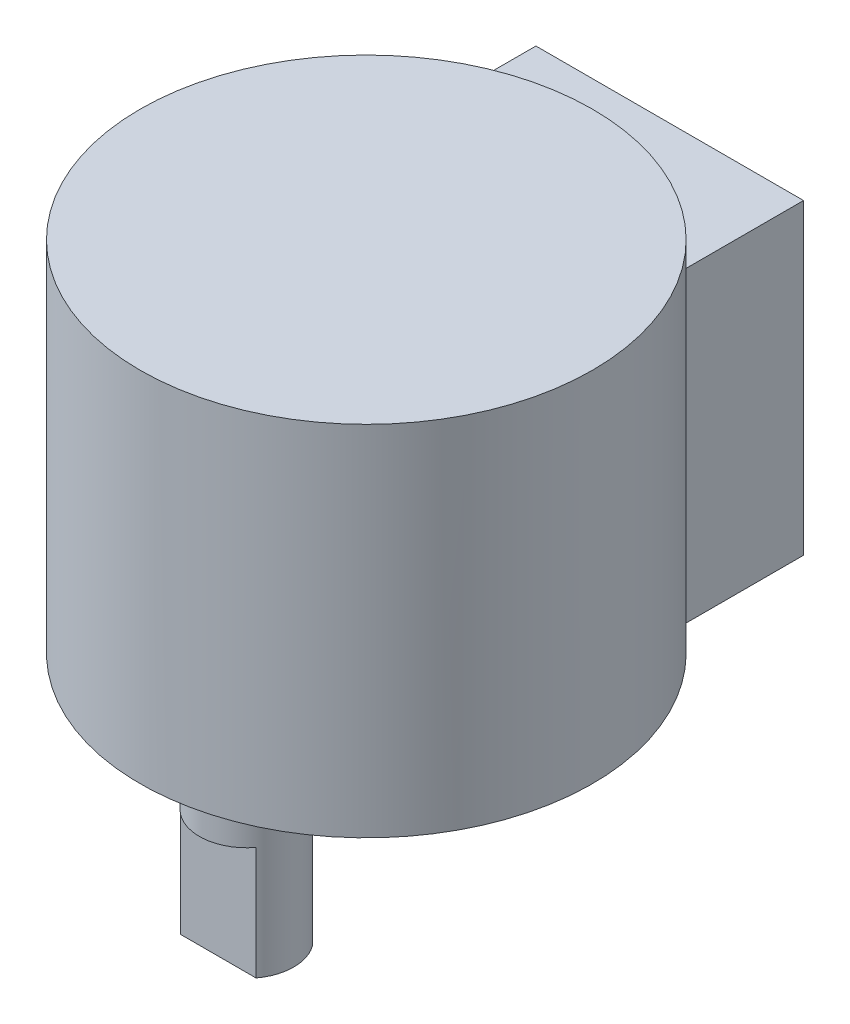
ISO-10303-21;
HEADER;
FILE_DESCRIPTION(('STEP AP214'),'2;1');
FILE_NAME('part.step','',(''),(''),'','','');
FILE_SCHEMA(('AUTOMOTIVE_DESIGN { 1 0 10303 214 1 1 1 1 }'));
ENDSEC;
DATA;
#1=APPLICATION_CONTEXT('core data for automotive mechanical design processes');
#2=APPLICATION_PROTOCOL_DEFINITION('international standard','automotive_design',2000,#1);
#3=PRODUCT_CONTEXT('',#1,'mechanical');
#4=PRODUCT('Part','Part','',(#3));
#5=PRODUCT_RELATED_PRODUCT_CATEGORY('part','',(#4));
#6=PRODUCT_DEFINITION_FORMATION('','',#4);
#7=PRODUCT_DEFINITION_CONTEXT('part definition',#1,'design');
#8=PRODUCT_DEFINITION('design','',#6,#7);
#9=PRODUCT_DEFINITION_SHAPE('','',#8);
#10=(LENGTH_UNIT() NAMED_UNIT(*) SI_UNIT(.MILLI.,.METRE.));
#11=(NAMED_UNIT(*) PLANE_ANGLE_UNIT() SI_UNIT($,.RADIAN.));
#12=(NAMED_UNIT(*) SI_UNIT($,.STERADIAN.) SOLID_ANGLE_UNIT());
#13=UNCERTAINTY_MEASURE_WITH_UNIT(LENGTH_MEASURE(1.E-05),#10,'distance_accuracy_value','');
#14=(GEOMETRIC_REPRESENTATION_CONTEXT(3) GLOBAL_UNCERTAINTY_ASSIGNED_CONTEXT((#13)) GLOBAL_UNIT_ASSIGNED_CONTEXT((#10,
#11,#12)) REPRESENTATION_CONTEXT('',''));
#15=CARTESIAN_POINT('',(0.,0.,0.));
#16=DIRECTION('',(0.,0.,1.));
#17=DIRECTION('',(1.,0.,0.));
#18=AXIS2_PLACEMENT_3D('',#15,#16,#17);
#19=CARTESIAN_POINT('',(0.,-4.,6.35));
#20=DIRECTION('',(0.,-1.,0.));
#21=DIRECTION('',(0.,0.,-1.));
#22=AXIS2_PLACEMENT_3D('',#19,#20,#21);
#23=PLANE('',#22);
#24=DIRECTION('',(-1.,0.,0.));
#25=VECTOR('',#24,1.);
#26=CARTESIAN_POINT('',(-2.,-4.,7.85));
#27=LINE('',#26,#25);
#28=CARTESIAN_POINT('',(2.,-4.,7.85));
#29=VERTEX_POINT('',#28);
#30=CARTESIAN_POINT('',(-2.,-4.,7.85));
#31=VERTEX_POINT('',#30);
#32=EDGE_CURVE('E129',#29,#31,#27,.T.);
#33=ORIENTED_EDGE('',*,*,#32,.F.);
#34=CARTESIAN_POINT('',(0.,-4.,6.35));
#35=DIRECTION('',(0.,-1.,0.));
#36=DIRECTION('',(0.,0.,-1.));
#37=AXIS2_PLACEMENT_3D('',#34,#35,#36);
#38=CIRCLE('',#37,2.5);
#39=EDGE_CURVE('E64',#29,#31,#38,.T.);
#40=ORIENTED_EDGE('',*,*,#39,.T.);
#41=EDGE_LOOP('',(#33,#40));
#42=FACE_BOUND('',#41,.T.);
#43=ADVANCED_FACE('F41',(#42),#23,.T.);
#44=CARTESIAN_POINT('',(0.,19.,0.));
#45=DIRECTION('',(0.,-1.,0.));
#46=DIRECTION('',(0.,0.,-1.));
#47=AXIS2_PLACEMENT_3D('',#44,#45,#46);
#48=CYLINDRICAL_SURFACE('',#47,12.);
#49=CARTESIAN_POINT('',(0.,19.,0.));
#50=DIRECTION('',(0.,1.,0.));
#51=DIRECTION('',(0.,0.,1.));
#52=AXIS2_PLACEMENT_3D('',#49,#50,#51);
#53=CIRCLE('',#52,12.);
#54=CARTESIAN_POINT('',(0.,19.,12.));
#55=VERTEX_POINT('',#54);
#56=EDGE_CURVE('E186',#55,#55,#53,.T.);
#57=ORIENTED_EDGE('',*,*,#56,.F.);
#58=EDGE_LOOP('',(#57));
#59=FACE_BOUND('',#58,.T.);
#60=CARTESIAN_POINT('',(0.,16.3,0.));
#61=DIRECTION('',(0.,1.,0.));
#62=DIRECTION('',(0.,0.,1.));
#63=AXIS2_PLACEMENT_3D('',#60,#61,#62);
#64=CIRCLE('',#63,12.);
#65=CARTESIAN_POINT('',(7.1,16.3,-9.67419247275968));
#66=VERTEX_POINT('',#65);
#67=CARTESIAN_POINT('',(-7.1,16.3,-9.67419247275968));
#68=VERTEX_POINT('',#67);
#69=EDGE_CURVE('E190',#66,#68,#64,.T.);
#70=ORIENTED_EDGE('',*,*,#69,.T.);
#71=DIRECTION('',(0.,-1.,0.));
#72=VECTOR('',#71,1.);
#73=CARTESIAN_POINT('',(-7.1,16.3,-9.67419247275968));
#74=LINE('',#73,#72);
#75=CARTESIAN_POINT('',(-7.1,0.,-9.67419247275968));
#76=VERTEX_POINT('',#75);
#77=EDGE_CURVE('E179',#68,#76,#74,.T.);
#78=ORIENTED_EDGE('',*,*,#77,.T.);
#79=CARTESIAN_POINT('',(0.,0.,0.));
#80=DIRECTION('',(0.,1.,0.));
#81=DIRECTION('',(0.,0.,1.));
#82=AXIS2_PLACEMENT_3D('',#79,#80,#81);
#83=CIRCLE('',#82,12.);
#84=CARTESIAN_POINT('',(7.1,0.,-9.67419247275968));
#85=VERTEX_POINT('',#84);
#86=EDGE_CURVE('E175',#76,#85,#83,.T.);
#87=ORIENTED_EDGE('',*,*,#86,.T.);
#88=DIRECTION('',(0.,-1.,0.));
#89=VECTOR('',#88,1.);
#90=CARTESIAN_POINT('',(7.1,16.3,-9.67419247275968));
#91=LINE('',#90,#89);
#92=EDGE_CURVE('E161',#66,#85,#91,.T.);
#93=ORIENTED_EDGE('',*,*,#92,.F.);
#94=EDGE_LOOP('',(#70,#78,#87,#93));
#95=FACE_BOUND('',#94,.T.);
#96=ADVANCED_FACE('F43',(#59,#95),#48,.T.);
#97=CARTESIAN_POINT('',(0.,19.,0.));
#98=DIRECTION('',(0.,1.,0.));
#99=DIRECTION('',(0.,0.,1.));
#100=AXIS2_PLACEMENT_3D('',#97,#98,#99);
#101=PLANE('',#100);
#102=ORIENTED_EDGE('',*,*,#56,.T.);
#103=EDGE_LOOP('',(#102));
#104=FACE_BOUND('',#103,.T.);
#105=ADVANCED_FACE('F206',(#104),#101,.T.);
#106=CARTESIAN_POINT('',(0.,0.,0.));
#107=DIRECTION('',(0.,1.,0.));
#108=DIRECTION('',(0.,0.,1.));
#109=AXIS2_PLACEMENT_3D('',#106,#107,#108);
#110=PLANE('',#109);
#111=CARTESIAN_POINT('',(0.,0.,6.35));
#112=DIRECTION('',(0.,1.,0.));
#113=DIRECTION('',(0.,0.,1.));
#114=AXIS2_PLACEMENT_3D('',#111,#112,#113);
#115=CIRCLE('',#114,3.5);
#116=CARTESIAN_POINT('',(0.,0.,9.85));
#117=VERTEX_POINT('',#116);
#118=EDGE_CURVE('E45',#117,#117,#115,.F.);
#119=ORIENTED_EDGE('',*,*,#118,.F.);
#120=EDGE_LOOP('',(#119));
#121=FACE_BOUND('',#120,.T.);
#122=ORIENTED_EDGE('',*,*,#86,.F.);
#123=DIRECTION('',(0.,0.,-1.));
#124=VECTOR('',#123,1.);
#125=CARTESIAN_POINT('',(-7.1,0.,-16.1));
#126=LINE('',#125,#124);
#127=CARTESIAN_POINT('',(-7.1,0.,-16.1));
#128=VERTEX_POINT('',#127);
#129=EDGE_CURVE('E165',#76,#128,#126,.T.);
#130=ORIENTED_EDGE('',*,*,#129,.T.);
#131=DIRECTION('',(1.,0.,0.));
#132=VECTOR('',#131,1.);
#133=CARTESIAN_POINT('',(-7.1,0.,-16.1));
#134=LINE('',#133,#132);
#135=CARTESIAN_POINT('',(7.1,0.,-16.1));
#136=VERTEX_POINT('',#135);
#137=EDGE_CURVE('E153',#128,#136,#134,.T.);
#138=ORIENTED_EDGE('',*,*,#137,.T.);
#139=DIRECTION('',(0.,0.,1.));
#140=VECTOR('',#139,1.);
#141=CARTESIAN_POINT('',(7.1,0.,-16.1));
#142=LINE('',#141,#140);
#143=EDGE_CURVE('E147',#136,#85,#142,.T.);
#144=ORIENTED_EDGE('',*,*,#143,.T.);
#145=EDGE_LOOP('',(#122,#130,#138,#144));
#146=FACE_BOUND('',#145,.T.);
#147=ADVANCED_FACE('F202',(#121,#146),#110,.F.);
#148=CARTESIAN_POINT('',(7.1,16.3,-16.1));
#149=DIRECTION('',(1.,0.,0.));
#150=DIRECTION('',(0.,0.,-1.));
#151=AXIS2_PLACEMENT_3D('',#148,#149,#150);
#152=PLANE('',#151);
#153=ORIENTED_EDGE('',*,*,#143,.F.);
#154=DIRECTION('',(0.,-1.,0.));
#155=VECTOR('',#154,1.);
#156=CARTESIAN_POINT('',(7.1,16.3,-16.1));
#157=LINE('',#156,#155);
#158=CARTESIAN_POINT('',(7.1,16.3,-16.1));
#159=VERTEX_POINT('',#158);
#160=EDGE_CURVE('E172',#159,#136,#157,.T.);
#161=ORIENTED_EDGE('',*,*,#160,.F.);
#162=DIRECTION('',(0.,0.,1.));
#163=VECTOR('',#162,1.);
#164=CARTESIAN_POINT('',(7.1,16.3,-16.1));
#165=LINE('',#164,#163);
#166=EDGE_CURVE('E148',#159,#66,#165,.T.);
#167=ORIENTED_EDGE('',*,*,#166,.T.);
#168=ORIENTED_EDGE('',*,*,#92,.T.);
#169=EDGE_LOOP('',(#153,#161,#167,#168));
#170=FACE_BOUND('',#169,.T.);
#171=ADVANCED_FACE('F205',(#170),#152,.T.);
#172=CARTESIAN_POINT('',(-7.1,16.3,-16.1));
#173=DIRECTION('',(0.,0.,-1.));
#174=DIRECTION('',(-1.,0.,0.));
#175=AXIS2_PLACEMENT_3D('',#172,#173,#174);
#176=PLANE('',#175);
#177=CARTESIAN_POINT('',(-3.9,2.5,-16.1));
#178=DIRECTION('',(0.,0.,-1.));
#179=DIRECTION('',(-1.,0.,0.));
#180=AXIS2_PLACEMENT_3D('',#177,#178,#179);
#181=CIRCLE('',#180,0.7);
#182=CARTESIAN_POINT('',(-4.6,2.5,-16.1));
#183=VERTEX_POINT('',#182);
#184=EDGE_CURVE('E314',#183,#183,#181,.T.);
#185=ORIENTED_EDGE('',*,*,#184,.F.);
#186=EDGE_LOOP('',(#185));
#187=FACE_BOUND('',#186,.T.);
#188=CARTESIAN_POINT('',(-2.4,2.5,-16.1));
#189=DIRECTION('',(0.,0.,-1.));
#190=DIRECTION('',(-1.,0.,0.));
#191=AXIS2_PLACEMENT_3D('',#188,#189,#190);
#192=CIRCLE('',#191,0.7);
#193=CARTESIAN_POINT('',(-3.1,2.5,-16.1));
#194=VERTEX_POINT('',#193);
#195=EDGE_CURVE('E318',#194,#194,#192,.T.);
#196=ORIENTED_EDGE('',*,*,#195,.F.);
#197=EDGE_LOOP('',(#196));
#198=FACE_BOUND('',#197,.T.);
#199=CARTESIAN_POINT('',(-0.900000000000001,2.5,-16.1));
#200=DIRECTION('',(0.,0.,-1.));
#201=DIRECTION('',(-1.,0.,0.));
#202=AXIS2_PLACEMENT_3D('',#199,#200,#201);
#203=CIRCLE('',#202,0.7);
#204=CARTESIAN_POINT('',(-1.6,2.5,-16.1));
#205=VERTEX_POINT('',#204);
#206=EDGE_CURVE('E322',#205,#205,#203,.T.);
#207=ORIENTED_EDGE('',*,*,#206,.F.);
#208=EDGE_LOOP('',(#207));
#209=FACE_BOUND('',#208,.T.);
#210=CARTESIAN_POINT('',(0.599999999999999,2.5,-16.1));
#211=DIRECTION('',(0.,0.,-1.));
#212=DIRECTION('',(-1.,0.,0.));
#213=AXIS2_PLACEMENT_3D('',#210,#211,#212);
#214=CIRCLE('',#213,0.7);
#215=CARTESIAN_POINT('',(-0.100000000000001,2.5,-16.1));
#216=VERTEX_POINT('',#215);
#217=EDGE_CURVE('E326',#216,#216,#214,.T.);
#218=ORIENTED_EDGE('',*,*,#217,.F.);
#219=EDGE_LOOP('',(#218));
#220=FACE_BOUND('',#219,.T.);
#221=CARTESIAN_POINT('',(2.1,2.5,-16.1));
#222=DIRECTION('',(0.,0.,-1.));
#223=DIRECTION('',(-1.,0.,0.));
#224=AXIS2_PLACEMENT_3D('',#221,#222,#223);
#225=CIRCLE('',#224,0.7);
#226=CARTESIAN_POINT('',(1.4,2.5,-16.1));
#227=VERTEX_POINT('',#226);
#228=EDGE_CURVE('E330',#227,#227,#225,.T.);
#229=ORIENTED_EDGE('',*,*,#228,.F.);
#230=EDGE_LOOP('',(#229));
#231=FACE_BOUND('',#230,.T.);
#232=CARTESIAN_POINT('',(3.6,2.5,-16.1));
#233=DIRECTION('',(0.,0.,-1.));
#234=DIRECTION('',(-1.,0.,0.));
#235=AXIS2_PLACEMENT_3D('',#232,#233,#234);
#236=CIRCLE('',#235,0.7);
#237=CARTESIAN_POINT('',(2.9,2.5,-16.1));
#238=VERTEX_POINT('',#237);
#239=EDGE_CURVE('E333',#238,#238,#236,.T.);
#240=ORIENTED_EDGE('',*,*,#239,.F.);
#241=EDGE_LOOP('',(#240));
#242=FACE_BOUND('',#241,.T.);
#243=ORIENTED_EDGE('',*,*,#137,.F.);
#244=DIRECTION('',(0.,-1.,0.));
#245=VECTOR('',#244,1.);
#246=CARTESIAN_POINT('',(-7.1,16.3,-16.1));
#247=LINE('',#246,#245);
#248=CARTESIAN_POINT('',(-7.1,16.3,-16.1));
#249=VERTEX_POINT('',#248);
#250=EDGE_CURVE('E176',#249,#128,#247,.T.);
#251=ORIENTED_EDGE('',*,*,#250,.F.);
#252=DIRECTION('',(1.,0.,0.));
#253=VECTOR('',#252,1.);
#254=CARTESIAN_POINT('',(-7.1,16.3,-16.1));
#255=LINE('',#254,#253);
#256=EDGE_CURVE('E157',#249,#159,#255,.T.);
#257=ORIENTED_EDGE('',*,*,#256,.T.);
#258=ORIENTED_EDGE('',*,*,#160,.T.);
#259=EDGE_LOOP('',(#243,#251,#257,#258));
#260=FACE_BOUND('',#259,.T.);
#261=ADVANCED_FACE('F215',(#187,#198,#209,#220,#231,#242,#260),#176,.T.);
#262=CARTESIAN_POINT('',(-7.1,16.3,-16.1));
#263=DIRECTION('',(-1.,0.,0.));
#264=DIRECTION('',(0.,0.,1.));
#265=AXIS2_PLACEMENT_3D('',#262,#263,#264);
#266=PLANE('',#265);
#267=ORIENTED_EDGE('',*,*,#129,.F.);
#268=ORIENTED_EDGE('',*,*,#77,.F.);
#269=DIRECTION('',(0.,0.,-1.));
#270=VECTOR('',#269,1.);
#271=CARTESIAN_POINT('',(-7.1,16.3,-16.1));
#272=LINE('',#271,#270);
#273=EDGE_CURVE('E152',#68,#249,#272,.T.);
#274=ORIENTED_EDGE('',*,*,#273,.T.);
#275=ORIENTED_EDGE('',*,*,#250,.T.);
#276=EDGE_LOOP('',(#267,#268,#274,#275));
#277=FACE_BOUND('',#276,.T.);
#278=ADVANCED_FACE('F212',(#277),#266,.T.);
#279=CARTESIAN_POINT('',(0.,16.3,0.));
#280=DIRECTION('',(0.,1.,0.));
#281=DIRECTION('',(0.,0.,1.));
#282=AXIS2_PLACEMENT_3D('',#279,#280,#281);
#283=PLANE('',#282);
#284=ORIENTED_EDGE('',*,*,#69,.F.);
#285=ORIENTED_EDGE('',*,*,#166,.F.);
#286=ORIENTED_EDGE('',*,*,#256,.F.);
#287=ORIENTED_EDGE('',*,*,#273,.F.);
#288=EDGE_LOOP('',(#284,#285,#286,#287));
#289=FACE_BOUND('',#288,.T.);
#290=ADVANCED_FACE('F219',(#289),#283,.T.);
#291=CARTESIAN_POINT('',(0.,-1.,6.35));
#292=DIRECTION('',(0.,1.,0.));
#293=DIRECTION('',(0.,0.,1.));
#294=AXIS2_PLACEMENT_3D('',#291,#292,#293);
#295=CYLINDRICAL_SURFACE('',#294,3.5);
#296=CARTESIAN_POINT('',(0.,-1.,6.35));
#297=DIRECTION('',(0.,-1.,0.));
#298=DIRECTION('',(0.,0.,-1.));
#299=AXIS2_PLACEMENT_3D('',#296,#297,#298);
#300=CIRCLE('',#299,3.5);
#301=CARTESIAN_POINT('',(0.,-1.,2.85));
#302=VERTEX_POINT('',#301);
#303=EDGE_CURVE('E143',#302,#302,#300,.T.);
#304=ORIENTED_EDGE('',*,*,#303,.F.);
#305=EDGE_LOOP('',(#304));
#306=FACE_BOUND('',#305,.T.);
#307=ORIENTED_EDGE('',*,*,#118,.T.);
#308=EDGE_LOOP('',(#307));
#309=FACE_BOUND('',#308,.T.);
#310=ADVANCED_FACE('F200',(#306,#309),#295,.T.);
#311=CARTESIAN_POINT('',(0.,-1.,6.35));
#312=DIRECTION('',(0.,-1.,0.));
#313=DIRECTION('',(0.,0.,-1.));
#314=AXIS2_PLACEMENT_3D('',#311,#312,#313);
#315=PLANE('',#314);
#316=CARTESIAN_POINT('',(0.,-1.,6.35));
#317=DIRECTION('',(0.,-1.,0.));
#318=DIRECTION('',(0.,0.,-1.));
#319=AXIS2_PLACEMENT_3D('',#316,#317,#318);
#320=CIRCLE('',#319,2.5);
#321=CARTESIAN_POINT('',(0.,-1.,3.85));
#322=VERTEX_POINT('',#321);
#323=EDGE_CURVE('E11',#322,#322,#320,.T.);
#324=ORIENTED_EDGE('',*,*,#323,.F.);
#325=EDGE_LOOP('',(#324));
#326=FACE_BOUND('',#325,.T.);
#327=ORIENTED_EDGE('',*,*,#303,.T.);
#328=EDGE_LOOP('',(#327));
#329=FACE_BOUND('',#328,.T.);
#330=ADVANCED_FACE('F226',(#326,#329),#315,.T.);
#331=CARTESIAN_POINT('',(0.,-4.,6.35));
#332=DIRECTION('',(0.,1.,0.));
#333=DIRECTION('',(0.,0.,1.));
#334=AXIS2_PLACEMENT_3D('',#331,#332,#333);
#335=CYLINDRICAL_SURFACE('',#334,2.5);
#336=ORIENTED_EDGE('',*,*,#39,.F.);
#337=DIRECTION('',(0.,1.,0.));
#338=VECTOR('',#337,1.);
#339=CARTESIAN_POINT('',(2.,-10.,7.85));
#340=LINE('',#339,#338);
#341=CARTESIAN_POINT('',(2.,-10.,7.85));
#342=VERTEX_POINT('',#341);
#343=EDGE_CURVE('E139',#342,#29,#340,.T.);
#344=ORIENTED_EDGE('',*,*,#343,.F.);
#345=CARTESIAN_POINT('',(0.,-10.,6.35));
#346=DIRECTION('',(0.,-1.,0.));
#347=DIRECTION('',(0.,0.,-1.));
#348=AXIS2_PLACEMENT_3D('',#345,#346,#347);
#349=CIRCLE('',#348,2.5);
#350=CARTESIAN_POINT('',(2.,-10.,4.85));
#351=VERTEX_POINT('',#350);
#352=EDGE_CURVE('E118',#351,#342,#349,.T.);
#353=ORIENTED_EDGE('',*,*,#352,.F.);
#354=DIRECTION('',(0.,1.,0.));
#355=VECTOR('',#354,1.);
#356=CARTESIAN_POINT('',(2.,-10.,4.85));
#357=LINE('',#356,#355);
#358=CARTESIAN_POINT('',(2.,-4.,4.85));
#359=VERTEX_POINT('',#358);
#360=EDGE_CURVE('E114',#351,#359,#357,.T.);
#361=ORIENTED_EDGE('',*,*,#360,.T.);
#362=CARTESIAN_POINT('',(-2.,-4.,4.85));
#363=VERTEX_POINT('',#362);
#364=EDGE_CURVE('E133',#363,#359,#38,.T.);
#365=ORIENTED_EDGE('',*,*,#364,.F.);
#366=DIRECTION('',(0.,1.,0.));
#367=VECTOR('',#366,1.);
#368=CARTESIAN_POINT('',(-2.,-10.,4.85));
#369=LINE('',#368,#367);
#370=CARTESIAN_POINT('',(-2.,-10.,4.85));
#371=VERTEX_POINT('',#370);
#372=EDGE_CURVE('E112',#371,#363,#369,.T.);
#373=ORIENTED_EDGE('',*,*,#372,.F.);
#374=CARTESIAN_POINT('',(0.,-10.,6.35));
#375=DIRECTION('',(0.,-1.,0.));
#376=DIRECTION('',(0.,0.,-1.));
#377=AXIS2_PLACEMENT_3D('',#374,#375,#376);
#378=CIRCLE('',#377,2.5);
#379=CARTESIAN_POINT('',(-2.,-10.,7.85));
#380=VERTEX_POINT('',#379);
#381=EDGE_CURVE('E119',#380,#371,#378,.T.);
#382=ORIENTED_EDGE('',*,*,#381,.F.);
#383=DIRECTION('',(0.,1.,0.));
#384=VECTOR('',#383,1.);
#385=CARTESIAN_POINT('',(-2.,-10.,7.85));
#386=LINE('',#385,#384);
#387=EDGE_CURVE('E351',#380,#31,#386,.T.);
#388=ORIENTED_EDGE('',*,*,#387,.T.);
#389=EDGE_LOOP('',(#336,#344,#353,#361,#365,#373,#382,#388));
#390=FACE_BOUND('',#389,.T.);
#391=ORIENTED_EDGE('',*,*,#323,.T.);
#392=EDGE_LOOP('',(#391));
#393=FACE_BOUND('',#392,.T.);
#394=ADVANCED_FACE('F131',(#390,#393),#335,.T.);
#395=DIRECTION('',(1.,0.,0.));
#396=VECTOR('',#395,1.);
#397=CARTESIAN_POINT('',(-2.,-4.,4.85));
#398=LINE('',#397,#396);
#399=EDGE_CURVE('E57',#363,#359,#398,.T.);
#400=ORIENTED_EDGE('',*,*,#399,.F.);
#401=ORIENTED_EDGE('',*,*,#364,.T.);
#402=EDGE_LOOP('',(#400,#401));
#403=FACE_BOUND('',#402,.T.);
#404=ADVANCED_FACE('F233',(#403),#23,.T.);
#405=CARTESIAN_POINT('',(-2.,-10.,4.85));
#406=DIRECTION('',(0.,0.,1.));
#407=DIRECTION('',(1.,0.,0.));
#408=AXIS2_PLACEMENT_3D('',#405,#406,#407);
#409=PLANE('',#408);
#410=ORIENTED_EDGE('',*,*,#399,.T.);
#411=ORIENTED_EDGE('',*,*,#360,.F.);
#412=DIRECTION('',(1.,0.,0.));
#413=VECTOR('',#412,1.);
#414=CARTESIAN_POINT('',(-2.,-10.,4.85));
#415=LINE('',#414,#413);
#416=EDGE_CURVE('E108',#371,#351,#415,.T.);
#417=ORIENTED_EDGE('',*,*,#416,.F.);
#418=ORIENTED_EDGE('',*,*,#372,.T.);
#419=EDGE_LOOP('',(#410,#411,#417,#418));
#420=FACE_BOUND('',#419,.T.);
#421=ADVANCED_FACE('F110',(#420),#409,.F.);
#422=CARTESIAN_POINT('',(-2.,-10.,7.85));
#423=DIRECTION('',(0.,0.,-1.));
#424=DIRECTION('',(-1.,0.,0.));
#425=AXIS2_PLACEMENT_3D('',#422,#423,#424);
#426=PLANE('',#425);
#427=ORIENTED_EDGE('',*,*,#32,.T.);
#428=ORIENTED_EDGE('',*,*,#387,.F.);
#429=DIRECTION('',(-1.,0.,0.));
#430=VECTOR('',#429,1.);
#431=CARTESIAN_POINT('',(-2.,-10.,7.85));
#432=LINE('',#431,#430);
#433=EDGE_CURVE('E124',#342,#380,#432,.T.);
#434=ORIENTED_EDGE('',*,*,#433,.F.);
#435=ORIENTED_EDGE('',*,*,#343,.T.);
#436=EDGE_LOOP('',(#427,#428,#434,#435));
#437=FACE_BOUND('',#436,.T.);
#438=ADVANCED_FACE('F245',(#437),#426,.F.);
#439=CARTESIAN_POINT('',(0.,-10.,6.35));
#440=DIRECTION('',(0.,-1.,0.));
#441=DIRECTION('',(0.,0.,-1.));
#442=AXIS2_PLACEMENT_3D('',#439,#440,#441);
#443=PLANE('',#442);
#444=ORIENTED_EDGE('',*,*,#381,.T.);
#445=ORIENTED_EDGE('',*,*,#416,.T.);
#446=ORIENTED_EDGE('',*,*,#352,.T.);
#447=ORIENTED_EDGE('',*,*,#433,.T.);
#448=EDGE_LOOP('',(#444,#445,#446,#447));
#449=FACE_BOUND('',#448,.T.);
#450=ADVANCED_FACE('F122',(#449),#443,.T.);
#451=CARTESIAN_POINT('',(3.6,2.5,-18.1));
#452=DIRECTION('',(0.,0.,1.));
#453=DIRECTION('',(1.,0.,0.));
#454=AXIS2_PLACEMENT_3D('',#451,#452,#453);
#455=CYLINDRICAL_SURFACE('',#454,0.7);
#456=CARTESIAN_POINT('',(3.6,2.5,-18.1));
#457=DIRECTION('',(0.,0.,-1.));
#458=DIRECTION('',(-1.,0.,0.));
#459=AXIS2_PLACEMENT_3D('',#456,#457,#458);
#460=CIRCLE('',#459,0.7);
#461=CARTESIAN_POINT('',(2.9,2.5,-18.1));
#462=VERTEX_POINT('',#461);
#463=EDGE_CURVE('E336',#462,#462,#460,.T.);
#464=ORIENTED_EDGE('',*,*,#463,.F.);
#465=EDGE_LOOP('',(#464));
#466=FACE_BOUND('',#465,.T.);
#467=ORIENTED_EDGE('',*,*,#239,.T.);
#468=EDGE_LOOP('',(#467));
#469=FACE_BOUND('',#468,.T.);
#470=ADVANCED_FACE('F367',(#466,#469),#455,.T.);
#471=CARTESIAN_POINT('',(3.6,2.5,-18.1));
#472=DIRECTION('',(0.,0.,-1.));
#473=DIRECTION('',(-1.,0.,0.));
#474=AXIS2_PLACEMENT_3D('',#471,#472,#473);
#475=PLANE('',#474);
#476=ORIENTED_EDGE('',*,*,#463,.T.);
#477=EDGE_LOOP('',(#476));
#478=FACE_BOUND('',#477,.T.);
#479=ADVANCED_FACE('F372',(#478),#475,.T.);
#480=CARTESIAN_POINT('',(2.1,2.5,-18.1));
#481=DIRECTION('',(0.,0.,1.));
#482=DIRECTION('',(1.,0.,0.));
#483=AXIS2_PLACEMENT_3D('',#480,#481,#482);
#484=CYLINDRICAL_SURFACE('',#483,0.7);
#485=CARTESIAN_POINT('',(2.1,2.5,-18.1));
#486=DIRECTION('',(0.,0.,-1.));
#487=DIRECTION('',(-1.,0.,0.));
#488=AXIS2_PLACEMENT_3D('',#485,#486,#487);
#489=CIRCLE('',#488,0.7);
#490=CARTESIAN_POINT('',(1.4,2.5,-18.1));
#491=VERTEX_POINT('',#490);
#492=EDGE_CURVE('E337',#491,#491,#489,.T.);
#493=ORIENTED_EDGE('',*,*,#492,.F.);
#494=EDGE_LOOP('',(#493));
#495=FACE_BOUND('',#494,.T.);
#496=ORIENTED_EDGE('',*,*,#228,.T.);
#497=EDGE_LOOP('',(#496));
#498=FACE_BOUND('',#497,.T.);
#499=ADVANCED_FACE('F376',(#495,#498),#484,.T.);
#500=CARTESIAN_POINT('',(2.1,2.5,-18.1));
#501=DIRECTION('',(0.,0.,-1.));
#502=DIRECTION('',(-1.,0.,0.));
#503=AXIS2_PLACEMENT_3D('',#500,#501,#502);
#504=PLANE('',#503);
#505=ORIENTED_EDGE('',*,*,#492,.T.);
#506=EDGE_LOOP('',(#505));
#507=FACE_BOUND('',#506,.T.);
#508=ADVANCED_FACE('F380',(#507),#504,.T.);
#509=CARTESIAN_POINT('',(0.6,2.5,-18.1));
#510=DIRECTION('',(0.,0.,1.));
#511=DIRECTION('',(1.,0.,0.));
#512=AXIS2_PLACEMENT_3D('',#509,#510,#511);
#513=CYLINDRICAL_SURFACE('',#512,0.7);
#514=CARTESIAN_POINT('',(0.6,2.5,-18.1));
#515=DIRECTION('',(0.,0.,-1.));
#516=DIRECTION('',(-1.,0.,0.));
#517=AXIS2_PLACEMENT_3D('',#514,#515,#516);
#518=CIRCLE('',#517,0.7);
#519=CARTESIAN_POINT('',(-0.100000000000001,2.5,-18.1));
#520=VERTEX_POINT('',#519);
#521=EDGE_CURVE('E438',#520,#520,#518,.T.);
#522=ORIENTED_EDGE('',*,*,#521,.F.);
#523=EDGE_LOOP('',(#522));
#524=FACE_BOUND('',#523,.T.);
#525=ORIENTED_EDGE('',*,*,#217,.T.);
#526=EDGE_LOOP('',(#525));
#527=FACE_BOUND('',#526,.T.);
#528=ADVANCED_FACE('F384',(#524,#527),#513,.T.);
#529=CARTESIAN_POINT('',(0.6,2.5,-18.1));
#530=DIRECTION('',(0.,0.,-1.));
#531=DIRECTION('',(-1.,0.,0.));
#532=AXIS2_PLACEMENT_3D('',#529,#530,#531);
#533=PLANE('',#532);
#534=ORIENTED_EDGE('',*,*,#521,.T.);
#535=EDGE_LOOP('',(#534));
#536=FACE_BOUND('',#535,.T.);
#537=ADVANCED_FACE('F388',(#536),#533,.T.);
#538=CARTESIAN_POINT('',(-0.900000000000001,2.5,-18.1));
#539=DIRECTION('',(0.,0.,1.));
#540=DIRECTION('',(1.,0.,0.));
#541=AXIS2_PLACEMENT_3D('',#538,#539,#540);
#542=CYLINDRICAL_SURFACE('',#541,0.7);
#543=CARTESIAN_POINT('',(-0.900000000000001,2.5,-18.1));
#544=DIRECTION('',(0.,0.,-1.));
#545=DIRECTION('',(-1.,0.,0.));
#546=AXIS2_PLACEMENT_3D('',#543,#544,#545);
#547=CIRCLE('',#546,0.7);
#548=CARTESIAN_POINT('',(-1.6,2.5,-18.1));
#549=VERTEX_POINT('',#548);
#550=EDGE_CURVE('E432',#549,#549,#547,.T.);
#551=ORIENTED_EDGE('',*,*,#550,.F.);
#552=EDGE_LOOP('',(#551));
#553=FACE_BOUND('',#552,.T.);
#554=ORIENTED_EDGE('',*,*,#206,.T.);
#555=EDGE_LOOP('',(#554));
#556=FACE_BOUND('',#555,.T.);
#557=ADVANCED_FACE('F392',(#553,#556),#542,.T.);
#558=CARTESIAN_POINT('',(-0.900000000000001,2.5,-18.1));
#559=DIRECTION('',(0.,0.,-1.));
#560=DIRECTION('',(-1.,0.,0.));
#561=AXIS2_PLACEMENT_3D('',#558,#559,#560);
#562=PLANE('',#561);
#563=ORIENTED_EDGE('',*,*,#550,.T.);
#564=EDGE_LOOP('',(#563));
#565=FACE_BOUND('',#564,.T.);
#566=ADVANCED_FACE('F396',(#565),#562,.T.);
#567=CARTESIAN_POINT('',(-2.4,2.5,-18.1));
#568=DIRECTION('',(0.,0.,1.));
#569=DIRECTION('',(1.,0.,0.));
#570=AXIS2_PLACEMENT_3D('',#567,#568,#569);
#571=CYLINDRICAL_SURFACE('',#570,0.7);
#572=CARTESIAN_POINT('',(-2.4,2.5,-18.1));
#573=DIRECTION('',(0.,0.,-1.));
#574=DIRECTION('',(-1.,0.,0.));
#575=AXIS2_PLACEMENT_3D('',#572,#573,#574);
#576=CIRCLE('',#575,0.7);
#577=CARTESIAN_POINT('',(-3.1,2.5,-18.1));
#578=VERTEX_POINT('',#577);
#579=EDGE_CURVE('E425',#578,#578,#576,.T.);
#580=ORIENTED_EDGE('',*,*,#579,.F.);
#581=EDGE_LOOP('',(#580));
#582=FACE_BOUND('',#581,.T.);
#583=ORIENTED_EDGE('',*,*,#195,.T.);
#584=EDGE_LOOP('',(#583));
#585=FACE_BOUND('',#584,.T.);
#586=ADVANCED_FACE('F400',(#582,#585),#571,.T.);
#587=CARTESIAN_POINT('',(-2.4,2.5,-18.1));
#588=DIRECTION('',(0.,0.,-1.));
#589=DIRECTION('',(-1.,0.,0.));
#590=AXIS2_PLACEMENT_3D('',#587,#588,#589);
#591=PLANE('',#590);
#592=ORIENTED_EDGE('',*,*,#579,.T.);
#593=EDGE_LOOP('',(#592));
#594=FACE_BOUND('',#593,.T.);
#595=ADVANCED_FACE('F404',(#594),#591,.T.);
#596=CARTESIAN_POINT('',(-3.9,2.5,-18.1));
#597=DIRECTION('',(0.,0.,1.));
#598=DIRECTION('',(1.,0.,0.));
#599=AXIS2_PLACEMENT_3D('',#596,#597,#598);
#600=CYLINDRICAL_SURFACE('',#599,0.7);
#601=CARTESIAN_POINT('',(-3.9,2.5,-18.1));
#602=DIRECTION('',(0.,0.,-1.));
#603=DIRECTION('',(-1.,0.,0.));
#604=AXIS2_PLACEMENT_3D('',#601,#602,#603);
#605=CIRCLE('',#604,0.7);
#606=CARTESIAN_POINT('',(-4.6,2.5,-18.1));
#607=VERTEX_POINT('',#606);
#608=EDGE_CURVE('E420',#607,#607,#605,.T.);
#609=ORIENTED_EDGE('',*,*,#608,.F.);
#610=EDGE_LOOP('',(#609));
#611=FACE_BOUND('',#610,.T.);
#612=ORIENTED_EDGE('',*,*,#184,.T.);
#613=EDGE_LOOP('',(#612));
#614=FACE_BOUND('',#613,.T.);
#615=ADVANCED_FACE('F408',(#611,#614),#600,.T.);
#616=CARTESIAN_POINT('',(-3.9,2.5,-18.1));
#617=DIRECTION('',(0.,0.,-1.));
#618=DIRECTION('',(-1.,0.,0.));
#619=AXIS2_PLACEMENT_3D('',#616,#617,#618);
#620=PLANE('',#619);
#621=ORIENTED_EDGE('',*,*,#608,.T.);
#622=EDGE_LOOP('',(#621));
#623=FACE_BOUND('',#622,.T.);
#624=ADVANCED_FACE('F412',(#623),#620,.T.);
#625=CLOSED_SHELL('',(#43,#96,#105,#147,#171,#261,#278,#290,#310,#330,#394,#404,#421,#438,#450,
#470,#479,#499,#508,#528,#537,#557,#566,#586,#595,#615,#624));
#626=MANIFOLD_SOLID_BREP('B2',#625);
#627=ADVANCED_BREP_SHAPE_REPRESENTATION('',(#18,#626),#14);
#628=SHAPE_DEFINITION_REPRESENTATION(#9,#627);
ENDSEC;
END-ISO-10303-21;
